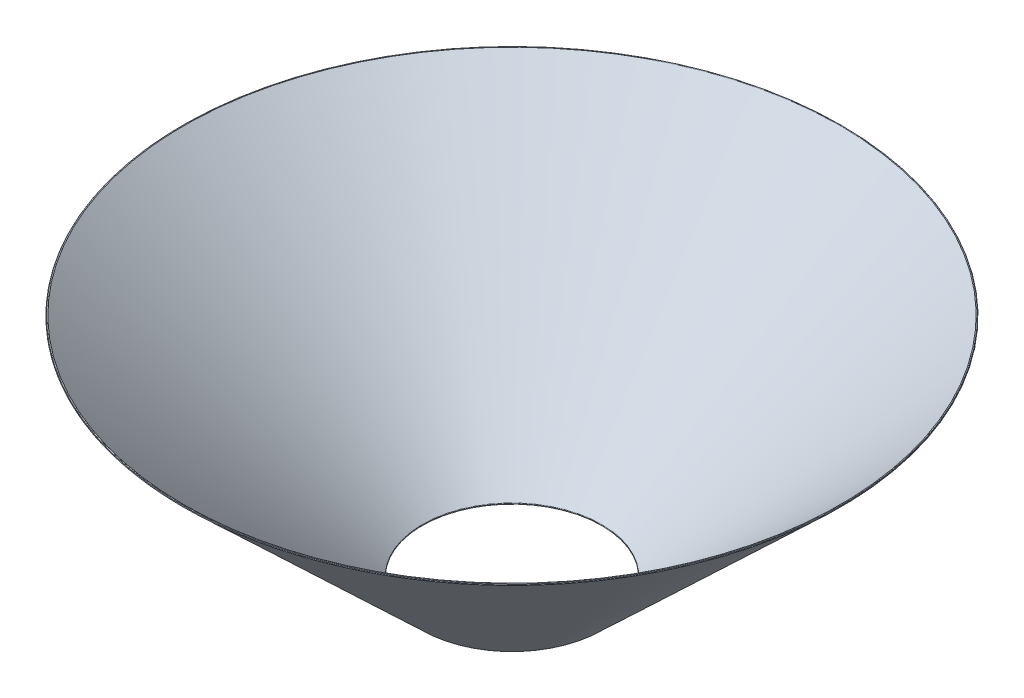
ISO-10303-21;
HEADER;
FILE_DESCRIPTION(('STEP AP214'),'2;1');
FILE_NAME('part.step','',(''),(''),'','','');
FILE_SCHEMA(('AUTOMOTIVE_DESIGN { 1 0 10303 214 1 1 1 1 }'));
ENDSEC;
DATA;
#1=APPLICATION_CONTEXT('core data for automotive mechanical design processes');
#2=APPLICATION_PROTOCOL_DEFINITION('international standard','automotive_design',2000,#1);
#3=PRODUCT_CONTEXT('',#1,'mechanical');
#4=PRODUCT('Part','Part','',(#3));
#5=PRODUCT_RELATED_PRODUCT_CATEGORY('part','',(#4));
#6=PRODUCT_DEFINITION_FORMATION('','',#4);
#7=PRODUCT_DEFINITION_CONTEXT('part definition',#1,'design');
#8=PRODUCT_DEFINITION('design','',#6,#7);
#9=PRODUCT_DEFINITION_SHAPE('','',#8);
#10=(LENGTH_UNIT() NAMED_UNIT(*) SI_UNIT(.MILLI.,.METRE.));
#11=(NAMED_UNIT(*) PLANE_ANGLE_UNIT() SI_UNIT($,.RADIAN.));
#12=(NAMED_UNIT(*) SI_UNIT($,.STERADIAN.) SOLID_ANGLE_UNIT());
#13=UNCERTAINTY_MEASURE_WITH_UNIT(LENGTH_MEASURE(1.E-05),#10,'distance_accuracy_value','');
#14=(GEOMETRIC_REPRESENTATION_CONTEXT(3) GLOBAL_UNCERTAINTY_ASSIGNED_CONTEXT((#13)) GLOBAL_UNIT_ASSIGNED_CONTEXT((#10,
#11,#12)) REPRESENTATION_CONTEXT('',''));
#15=CARTESIAN_POINT('',(0.,0.,0.));
#16=DIRECTION('',(0.,0.,1.));
#17=DIRECTION('',(1.,0.,0.));
#18=AXIS2_PLACEMENT_3D('',#15,#16,#17);
#19=CARTESIAN_POINT('',(0.,23.5333005830224,0.));
#20=DIRECTION('',(0.,-1.,0.));
#21=DIRECTION('',(0.,0.,-1.00000000000001));
#22=AXIS2_PLACEMENT_3D('',#19,#20,#21);
#23=TOROIDAL_SURFACE('',#22,27.3125538329806,0.200000000000009);
#24=CARTESIAN_POINT('',(0.,23.3957516534402,0.));
#25=DIRECTION('',(0.,-1.,0.));
#26=DIRECTION('',(0.,0.,-1.00000000000001));
#27=AXIS2_PLACEMENT_3D('',#24,#25,#26);
#28=CIRCLE('',#27,27.1673632961995);
#29=CARTESIAN_POINT('',(0.,23.3957516534402,-27.1673632961997));
#30=VERTEX_POINT('',#29);
#31=EDGE_CURVE('E12',#30,#30,#28,.T.);
#32=ORIENTED_EDGE('',*,*,#31,.T.);
#33=EDGE_LOOP('',(#32));
#34=FACE_BOUND('',#33,.T.);
#35=CARTESIAN_POINT('',(0.,23.6784911198035,0.));
#36=DIRECTION('',(0.,-1.,0.));
#37=DIRECTION('',(0.,0.,-1.00000000000001));
#38=AXIS2_PLACEMENT_3D('',#35,#36,#37);
#39=CIRCLE('',#38,27.1750049033984);
#40=CARTESIAN_POINT('',(0.,23.6784911198036,27.1750049033987));
#41=VERTEX_POINT('',#40);
#42=EDGE_CURVE('E70',#41,#41,#39,.T.);
#43=ORIENTED_EDGE('',*,*,#42,.F.);
#44=EDGE_LOOP('',(#43));
#45=FACE_BOUND('',#44,.T.);
#46=ADVANCED_FACE('F42',(#34,#45),#23,.T.);
#47=CARTESIAN_POINT('',(0.,23.3957516534402,0.));
#48=DIRECTION('',(0.,-1.,0.));
#49=DIRECTION('',(0.,0.,-1.00000000000001));
#50=AXIS2_PLACEMENT_3D('',#47,#48,#49);
#51=CONICAL_SURFACE('',#50,27.1673632961995,0.758377714210087);
#52=CARTESIAN_POINT('',(0.,23.3231563850496,0.));
#53=DIRECTION('',(0.,-1.,0.));
#54=DIRECTION('',(0.,0.,-1.00000000000001));
#55=AXIS2_PLACEMENT_3D('',#52,#53,#54);
#56=CIRCLE('',#55,27.2361377609905);
#57=CARTESIAN_POINT('',(0.,23.3231563850496,-27.2361377609908));
#58=VERTEX_POINT('',#57);
#59=EDGE_CURVE('E48',#58,#58,#56,.T.);
#60=ORIENTED_EDGE('',*,*,#59,.T.);
#61=EDGE_LOOP('',(#60));
#62=FACE_BOUND('',#61,.T.);
#63=ORIENTED_EDGE('',*,*,#31,.F.);
#64=EDGE_LOOP('',(#63));
#65=FACE_BOUND('',#64,.T.);
#66=ADVANCED_FACE('F78',(#62,#65),#51,.F.);
#67=CARTESIAN_POINT('',(0.,23.4607053146318,0.));
#68=DIRECTION('',(0.,-1.,0.));
#69=DIRECTION('',(0.,0.,-1.00000000000001));
#70=AXIS2_PLACEMENT_3D('',#67,#68,#69);
#71=TOROIDAL_SURFACE('',#70,27.3813282977717,0.200000000000015);
#72=CARTESIAN_POINT('',(0.,23.3155147778506,0.));
#73=DIRECTION('',(0.,-1.,0.));
#74=DIRECTION('',(0.,0.,-1.00000000000001));
#75=AXIS2_PLACEMENT_3D('',#72,#73,#74);
#76=CIRCLE('',#75,27.5188772273539);
#77=CARTESIAN_POINT('',(0.,23.3155147778506,27.5188772273542));
#78=VERTEX_POINT('',#77);
#79=EDGE_CURVE('E52',#78,#78,#76,.T.);
#80=ORIENTED_EDGE('',*,*,#79,.T.);
#81=EDGE_LOOP('',(#80));
#82=FACE_BOUND('',#81,.T.);
#83=ORIENTED_EDGE('',*,*,#59,.F.);
#84=EDGE_LOOP('',(#83));
#85=FACE_BOUND('',#84,.T.);
#86=ADVANCED_FACE('F82',(#82,#85),#71,.T.);
#87=CARTESIAN_POINT('',(0.,23.3155147778506,0.));
#88=DIRECTION('',(0.,1.,0.));
#89=DIRECTION('',(0.,0.,1.00000000000001));
#90=AXIS2_PLACEMENT_3D('',#87,#88,#89);
#91=CONICAL_SURFACE('',#90,27.5188772273539,0.812418612584714);
#92=CARTESIAN_POINT('',(0.,91.8148817097645,0.));
#93=DIRECTION('',(0.,-1.,0.));
#94=DIRECTION('',(0.,0.,-1.00000000000001));
#95=AXIS2_PLACEMENT_3D('',#92,#93,#94);
#96=CIRCLE('',#95,99.8237645443743);
#97=CARTESIAN_POINT('',(0.,91.8148817097645,99.8237645443753));
#98=VERTEX_POINT('',#97);
#99=EDGE_CURVE('E56',#98,#98,#96,.T.);
#100=CARTESIAN_POINT('',(0.,91.8148817097645,99.8237645443753));
#101=CARTESIAN_POINT('',(0.,91.1013466375571,99.070588634823));
#102=CARTESIAN_POINT('',(0.,90.3878115653497,98.3174127252707));
#103=CARTESIAN_POINT('',(0.,88.9607414209348,96.8110609061661));
#104=CARTESIAN_POINT('',(0.,88.2472063487274,96.0578849966138));
#105=CARTESIAN_POINT('',(0.,86.8201362043125,94.5515331775092));
#106=CARTESIAN_POINT('',(0.,86.106601132105,93.7983572679569));
#107=CARTESIAN_POINT('',(0.,84.6795309876902,92.2920054488523));
#108=CARTESIAN_POINT('',(0.,83.9659959154827,91.5388295393));
#109=CARTESIAN_POINT('',(0.,82.5389257710679,90.0324777201954));
#110=CARTESIAN_POINT('',(0.,81.8253906988604,89.2793018106431));
#111=CARTESIAN_POINT('',(0.,80.3983205544455,87.7729499915385));
#112=CARTESIAN_POINT('',(0.,79.6847854822381,87.0197740819861));
#113=CARTESIAN_POINT('',(0.,78.2577153378232,85.5134222628815));
#114=CARTESIAN_POINT('',(0.,77.5441802656158,84.7602463533292));
#115=CARTESIAN_POINT('',(0.,76.1171101212009,83.2538945342246));
#116=CARTESIAN_POINT('',(0.,75.4035750489935,82.5007186246723));
#117=CARTESIAN_POINT('',(0.,73.9765049045786,80.9943668055677));
#118=CARTESIAN_POINT('',(0.,73.2629698323712,80.2411908960154));
#119=CARTESIAN_POINT('',(0.,71.8358996879563,78.7348390769108));
#120=CARTESIAN_POINT('',(0.,71.1223646157489,77.9816631673585));
#121=CARTESIAN_POINT('',(0.,69.695294471334,76.4753113482539));
#122=CARTESIAN_POINT('',(0.,68.9817593991266,75.7221354387016));
#123=CARTESIAN_POINT('',(0.,67.5546892547117,74.215783619597));
#124=CARTESIAN_POINT('',(0.,66.8411541825043,73.4626077100447));
#125=CARTESIAN_POINT('',(0.,65.4140840380894,71.9562558909401));
#126=CARTESIAN_POINT('',(0.,64.7005489658819,71.2030799813878));
#127=CARTESIAN_POINT('',(0.,63.2734788214671,69.6967281622832));
#128=CARTESIAN_POINT('',(0.,62.5599437492596,68.9435522527308));
#129=CARTESIAN_POINT('',(0.,61.1328736048448,67.4372004336262));
#130=CARTESIAN_POINT('',(0.,60.4193385326373,66.6840245240739));
#131=CARTESIAN_POINT('',(0.,58.9922683882224,65.1776727049693));
#132=CARTESIAN_POINT('',(0.,58.278733316015,64.424496795417));
#133=CARTESIAN_POINT('',(0.,56.8516631716001,62.9181449763124));
#134=CARTESIAN_POINT('',(0.,56.1381280993927,62.1649690667601));
#135=CARTESIAN_POINT('',(0.,54.7110579549778,60.6586172476555));
#136=CARTESIAN_POINT('',(0.,53.9975228827704,59.9054413381032));
#137=CARTESIAN_POINT('',(0.,52.5704527383555,58.3990895189986));
#138=CARTESIAN_POINT('',(0.,51.8569176661481,57.6459136094463));
#139=CARTESIAN_POINT('',(0.,50.4298475217332,56.1395617903417));
#140=CARTESIAN_POINT('',(0.,49.7163124495258,55.3863858807894));
#141=CARTESIAN_POINT('',(0.,48.2892423051109,53.8800340616848));
#142=CARTESIAN_POINT('',(0.,47.5757072329035,53.1268581521325));
#143=CARTESIAN_POINT('',(0.,46.1486370884886,51.6205063330279));
#144=CARTESIAN_POINT('',(0.,45.4351020162811,50.8673304234756));
#145=CARTESIAN_POINT('',(0.,44.0080318718663,49.360978604371));
#146=CARTESIAN_POINT('',(0.,43.2944967996588,48.6078026948187));
#147=CARTESIAN_POINT('',(0.,41.867426655244,47.101450875714));
#148=CARTESIAN_POINT('',(0.,41.1538915830365,46.3482749661617));
#149=CARTESIAN_POINT('',(0.,39.7268214386216,44.8419231470571));
#150=CARTESIAN_POINT('',(0.,39.0132863664142,44.0887472375048));
#151=CARTESIAN_POINT('',(0.,37.5862162219993,42.5823954184002));
#152=CARTESIAN_POINT('',(0.,36.8726811497919,41.8292195088479));
#153=CARTESIAN_POINT('',(0.,35.445611005377,40.3228676897433));
#154=CARTESIAN_POINT('',(0.,34.7320759331696,39.569691780191));
#155=CARTESIAN_POINT('',(0.,33.3050057887547,38.0633399610864));
#156=CARTESIAN_POINT('',(0.,32.5914707165473,37.3101640515341));
#157=CARTESIAN_POINT('',(0.,31.1644005721324,35.8038122324295));
#158=CARTESIAN_POINT('',(0.,30.450865499925,35.0506363228772));
#159=CARTESIAN_POINT('',(0.,29.0237953555101,33.5442845037726));
#160=CARTESIAN_POINT('',(0.,28.3102602833027,32.7911085942203));
#161=CARTESIAN_POINT('',(0.,26.8831901388878,31.2847567751157));
#162=CARTESIAN_POINT('',(0.,26.1696550666803,30.5315808655634));
#163=CARTESIAN_POINT('',(0.,24.7425849222655,29.0252290464588));
#164=CARTESIAN_POINT('',(0.,24.029049850058,28.2720531369065));
#165=CARTESIAN_POINT('',(0.,23.3155147778506,27.5188772273542));
#166=B_SPLINE_CURVE_WITH_KNOTS('',3,(#100,#101,#102,#103,#104,#105,#106,#107,#108,#109,#110,
#111,#112,#113,#114,#115,#116,#117,#118,#119,#120,#121,#122,#123,#124,#125,#126,#127,#128,#129,
#130,#131,#132,#133,#134,#135,#136,#137,#138,#139,#140,#141,#142,#143,#144,#145,#146,#147,#148,
#149,#150,#151,#152,#153,#154,#155,#156,#157,#158,#159,#160,#161,#162,#163,#164,#165),
.UNSPECIFIED.,.F.,.F.,(4,2,2,2,2,2,2,2,2,2,2,2,2,2,2,2,2,2,2,2,2,2,2,2,2,2,2,2,2,2,2,2,4),(0.,
3.11250000000002,6.22500000000003,9.33750000000006,12.4500000000001,15.5625000000001,
18.6750000000001,21.7875000000001,24.9000000000002,28.0125000000002,31.1250000000002,
34.2375000000002,37.3500000000002,40.4625000000002,43.5750000000003,46.6875000000003,
49.8000000000003,52.9125000000003,56.0250000000003,59.1375000000003,62.2500000000004,
65.3625000000004,68.4750000000004,71.5875000000004,74.7000000000004,77.8125000000004,
80.9250000000004,84.0375000000005,87.1500000000005,90.2625000000005,93.3750000000005,
96.4875000000005,99.6000000000005),.UNSPECIFIED.);
#167=EDGE_CURVE('BSEAM86',#98,#78,#166,.T.);
#168=ORIENTED_EDGE('',*,*,#99,.T.);
#169=ORIENTED_EDGE('',*,*,#79,.F.);
#170=ORIENTED_EDGE('',*,*,#167,.T.);
#171=ORIENTED_EDGE('',*,*,#167,.F.);
#172=EDGE_LOOP('',(#168,#170,#169,#171));
#173=FACE_BOUND('',#172,.T.);
#174=ADVANCED_FACE('F86',(#173),#91,.T.);
#175=CARTESIAN_POINT('',(0.,91.9600722465457,0.));
#176=DIRECTION('',(0.,-1.,0.));
#177=DIRECTION('',(0.,0.,-1.00000000000001));
#178=AXIS2_PLACEMENT_3D('',#175,#176,#177);
#179=TOROIDAL_SURFACE('',#178,99.6862156147921,0.200000000000023);
#180=CARTESIAN_POINT('',(0.,92.0976211761279,0.));
#181=DIRECTION('',(0.,-1.,0.));
#182=DIRECTION('',(0.,0.,-1.00000000000001));
#183=AXIS2_PLACEMENT_3D('',#180,#181,#182);
#184=CIRCLE('',#183,99.8314061515732);
#185=CARTESIAN_POINT('',(0.,92.0976211761279,-99.8314061515743));
#186=VERTEX_POINT('',#185);
#187=EDGE_CURVE('E61',#186,#186,#184,.T.);
#188=ORIENTED_EDGE('',*,*,#187,.T.);
#189=EDGE_LOOP('',(#188));
#190=FACE_BOUND('',#189,.T.);
#191=ORIENTED_EDGE('',*,*,#99,.F.);
#192=EDGE_LOOP('',(#191));
#193=FACE_BOUND('',#192,.T.);
#194=ADVANCED_FACE('F93',(#190,#193),#179,.T.);
#195=CARTESIAN_POINT('',(0.,92.0976211761279,0.));
#196=DIRECTION('',(0.,-1.,0.));
#197=DIRECTION('',(0.,0.,-1.00000000000001));
#198=AXIS2_PLACEMENT_3D('',#195,#196,#197);
#199=CONICAL_SURFACE('',#198,99.8314061515732,0.758377714210353);
#200=CARTESIAN_POINT('',(0.,92.1702164445184,0.));
#201=DIRECTION('',(0.,-1.,0.));
#202=DIRECTION('',(0.,0.,-1.00000000000001));
#203=AXIS2_PLACEMENT_3D('',#200,#201,#202);
#204=CIRCLE('',#203,99.7626316867822);
#205=CARTESIAN_POINT('',(0.,92.1702164445184,-99.7626316867832));
#206=VERTEX_POINT('',#205);
#207=EDGE_CURVE('E64',#206,#206,#204,.T.);
#208=ORIENTED_EDGE('',*,*,#207,.T.);
#209=EDGE_LOOP('',(#208));
#210=FACE_BOUND('',#209,.T.);
#211=ORIENTED_EDGE('',*,*,#187,.F.);
#212=EDGE_LOOP('',(#211));
#213=FACE_BOUND('',#212,.T.);
#214=ADVANCED_FACE('F97',(#210,#213),#199,.T.);
#215=CARTESIAN_POINT('',(0.,92.0326675149363,0.));
#216=DIRECTION('',(0.,-1.,0.));
#217=DIRECTION('',(0.,0.,-1.00000000000001));
#218=AXIS2_PLACEMENT_3D('',#215,#216,#217);
#219=TOROIDAL_SURFACE('',#218,99.617441150001,0.200000000000009);
#220=CARTESIAN_POINT('',(0.,92.1778580517175,0.));
#221=DIRECTION('',(0.,-1.,0.));
#222=DIRECTION('',(0.,0.,-1.00000000000001));
#223=AXIS2_PLACEMENT_3D('',#220,#221,#222);
#224=CIRCLE('',#223,99.4798922204189);
#225=CARTESIAN_POINT('',(0.,92.1778580517175,99.4798922204199));
#226=VERTEX_POINT('',#225);
#227=EDGE_CURVE('E67',#226,#226,#224,.T.);
#228=ORIENTED_EDGE('',*,*,#227,.T.);
#229=EDGE_LOOP('',(#228));
#230=FACE_BOUND('',#229,.T.);
#231=ORIENTED_EDGE('',*,*,#207,.F.);
#232=EDGE_LOOP('',(#231));
#233=FACE_BOUND('',#232,.T.);
#234=ADVANCED_FACE('F101',(#230,#233),#219,.T.);
#235=CARTESIAN_POINT('',(0.,92.1778580517175,0.));
#236=DIRECTION('',(0.,1.,0.));
#237=DIRECTION('',(0.,0.,1.00000000000001));
#238=AXIS2_PLACEMENT_3D('',#235,#236,#237);
#239=CONICAL_SURFACE('',#238,99.4798922204189,0.812418612584714);
#240=CARTESIAN_POINT('',(0.,23.6784911198036,27.1750049033987));
#241=CARTESIAN_POINT('',(0.,24.392026192011,27.928180812951));
#242=CARTESIAN_POINT('',(0.,25.1055612642184,28.6813567225033));
#243=CARTESIAN_POINT('',(0.,26.5326314086333,30.1877085416079));
#244=CARTESIAN_POINT('',(0.,27.2461664808407,30.9408844511602));
#245=CARTESIAN_POINT('',(0.,28.6732366252556,32.4472362702649));
#246=CARTESIAN_POINT('',(0.,29.386771697463,33.2004121798172));
#247=CARTESIAN_POINT('',(0.,30.8138418418779,34.7067639989218));
#248=CARTESIAN_POINT('',(0.,31.5273769140854,35.4599399084741));
#249=CARTESIAN_POINT('',(0.,32.9544470585002,36.9662917275787));
#250=CARTESIAN_POINT('',(0.,33.6679821307077,37.719467637131));
#251=CARTESIAN_POINT('',(0.,35.0950522751225,39.2258194562356));
#252=CARTESIAN_POINT('',(0.,35.80858734733,39.9789953657879));
#253=CARTESIAN_POINT('',(0.,37.2356574917448,41.4853471848925));
#254=CARTESIAN_POINT('',(0.,37.9491925639523,42.2385230944448));
#255=CARTESIAN_POINT('',(0.,39.3762627083672,43.7448749135494));
#256=CARTESIAN_POINT('',(0.,40.0897977805746,44.4980508231017));
#257=CARTESIAN_POINT('',(0.,41.5168679249895,46.0044026422063));
#258=CARTESIAN_POINT('',(0.,42.2304029971969,46.7575785517586));
#259=CARTESIAN_POINT('',(0.,43.6574731416118,48.2639303708632));
#260=CARTESIAN_POINT('',(0.,44.3710082138192,49.0171062804155));
#261=CARTESIAN_POINT('',(0.,45.7980783582341,50.5234580995202));
#262=CARTESIAN_POINT('',(0.,46.5116134304415,51.2766340090725));
#263=CARTESIAN_POINT('',(0.,47.9386835748564,52.7829858281771));
#264=CARTESIAN_POINT('',(0.,48.6522186470638,53.5361617377294));
#265=CARTESIAN_POINT('',(0.,50.0792887914787,55.042513556834));
#266=CARTESIAN_POINT('',(0.,50.7928238636861,55.7956894663863));
#267=CARTESIAN_POINT('',(0.,52.219894008101,57.3020412854909));
#268=CARTESIAN_POINT('',(0.,52.9334290803084,58.0552171950432));
#269=CARTESIAN_POINT('',(0.,54.3604992247233,59.5615690141478));
#270=CARTESIAN_POINT('',(0.,55.0740342969308,60.3147449237001));
#271=CARTESIAN_POINT('',(0.,56.5011044413456,61.8210967428047));
#272=CARTESIAN_POINT('',(0.,57.2146395135531,62.574272652357));
#273=CARTESIAN_POINT('',(0.,58.6417096579679,64.0806244714616));
#274=CARTESIAN_POINT('',(0.,59.3552447301754,64.8338003810139));
#275=CARTESIAN_POINT('',(0.,60.7823148745903,66.3401522001185));
#276=CARTESIAN_POINT('',(0.,61.4958499467977,67.0933281096708));
#277=CARTESIAN_POINT('',(0.,62.9229200912126,68.5996799287755));
#278=CARTESIAN_POINT('',(0.,63.63645516342,69.3528558383278));
#279=CARTESIAN_POINT('',(0.,65.0635253078349,70.8592076574324));
#280=CARTESIAN_POINT('',(0.,65.7770603800423,71.6123835669847));
#281=CARTESIAN_POINT('',(0.,67.2041305244572,73.1187353860893));
#282=CARTESIAN_POINT('',(0.,67.9176655966646,73.8719112956416));
#283=CARTESIAN_POINT('',(0.,69.3447357410795,75.3782631147462));
#284=CARTESIAN_POINT('',(0.,70.0582708132869,76.1314390242985));
#285=CARTESIAN_POINT('',(0.,71.4853409577018,77.6377908434031));
#286=CARTESIAN_POINT('',(0.,72.1988760299093,78.3909667529554));
#287=CARTESIAN_POINT('',(0.,73.6259461743241,79.89731857206));
#288=CARTESIAN_POINT('',(0.,74.3394812465315,80.6504944816123));
#289=CARTESIAN_POINT('',(0.,75.7665513909464,82.1568463007169));
#290=CARTESIAN_POINT('',(0.,76.4800864631539,82.9100222102692));
#291=CARTESIAN_POINT('',(0.,77.9071566075687,84.4163740293738));
#292=CARTESIAN_POINT('',(0.,78.6206916797762,85.1695499389262));
#293=CARTESIAN_POINT('',(0.,80.047761824191,86.6759017580308));
#294=CARTESIAN_POINT('',(0.,80.7612968963985,87.4290776675831));
#295=CARTESIAN_POINT('',(0.,82.1883670408133,88.9354294866877));
#296=CARTESIAN_POINT('',(0.,82.9019021130208,89.68860539624));
#297=CARTESIAN_POINT('',(0.,84.3289722574357,91.1949572153446));
#298=CARTESIAN_POINT('',(0.,85.0425073296431,91.9481331248969));
#299=CARTESIAN_POINT('',(0.,86.469577474058,93.4544849440015));
#300=CARTESIAN_POINT('',(0.,87.1831125462654,94.2076608535538));
#301=CARTESIAN_POINT('',(0.,88.6101826906803,95.7140126726584));
#302=CARTESIAN_POINT('',(0.,89.3237177628877,96.4671885822107));
#303=CARTESIAN_POINT('',(0.,90.7507879073026,97.9735404013153));
#304=CARTESIAN_POINT('',(0.,91.46432297951,98.7267163108676));
#305=CARTESIAN_POINT('',(0.,92.1778580517175,99.4798922204199));
#306=B_SPLINE_CURVE_WITH_KNOTS('',3,(#240,#241,#242,#243,#244,#245,#246,#247,#248,#249,#250,
#251,#252,#253,#254,#255,#256,#257,#258,#259,#260,#261,#262,#263,#264,#265,#266,#267,#268,#269,
#270,#271,#272,#273,#274,#275,#276,#277,#278,#279,#280,#281,#282,#283,#284,#285,#286,#287,#288,
#289,#290,#291,#292,#293,#294,#295,#296,#297,#298,#299,#300,#301,#302,#303,#304,#305),
.UNSPECIFIED.,.F.,.F.,(4,2,2,2,2,2,2,2,2,2,2,2,2,2,2,2,2,2,2,2,2,2,2,2,2,2,2,2,2,2,2,2,4),(0.,
3.11250000000001,6.22500000000003,9.33750000000005,12.4500000000001,15.5625000000001,
18.6750000000001,21.7875000000001,24.9000000000001,28.0125000000002,31.1250000000002,
34.2375000000002,37.3500000000002,40.4625000000002,43.5750000000002,46.6875000000003,
49.8000000000003,52.9125000000003,56.0250000000003,59.1375000000003,62.2500000000004,
65.3625000000004,68.4750000000004,71.5875000000004,74.7000000000004,77.8125000000004,
80.9250000000004,84.0375000000005,87.1500000000005,90.2625000000005,93.3750000000005,
96.4875000000005,99.6000000000005),.UNSPECIFIED.);
#307=EDGE_CURVE('BSEAM74',#41,#226,#306,.T.);
#308=ORIENTED_EDGE('',*,*,#42,.T.);
#309=ORIENTED_EDGE('',*,*,#227,.F.);
#310=ORIENTED_EDGE('',*,*,#307,.T.);
#311=ORIENTED_EDGE('',*,*,#307,.F.);
#312=EDGE_LOOP('',(#308,#310,#309,#311));
#313=FACE_BOUND('',#312,.T.);
#314=ADVANCED_FACE('F74',(#313),#239,.F.);
#315=CLOSED_SHELL('',(#46,#66,#86,#174,#194,#214,#234,#314));
#316=MANIFOLD_SOLID_BREP('B2',#315);
#317=ADVANCED_BREP_SHAPE_REPRESENTATION('',(#18,#316),#14);
#318=SHAPE_DEFINITION_REPRESENTATION(#9,#317);
ENDSEC;
END-ISO-10303-21;
